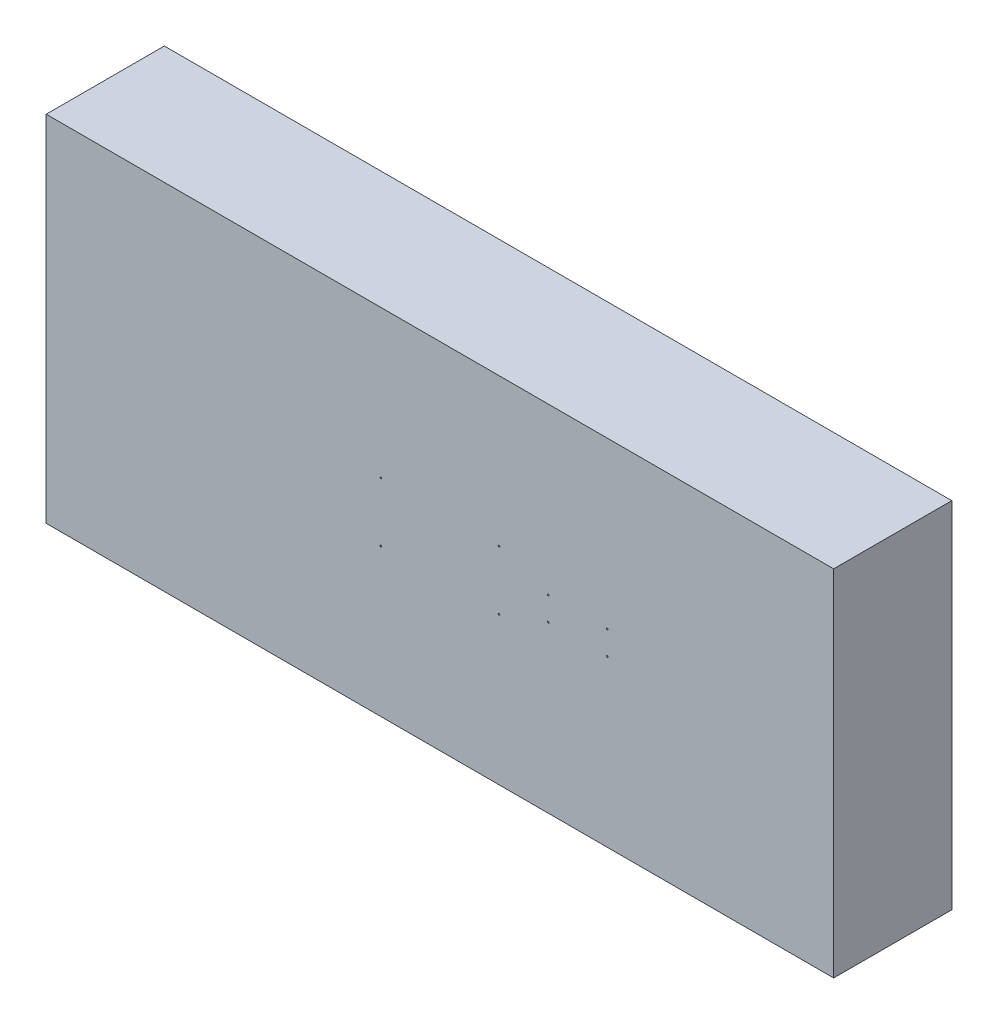
ISO-10303-21;
HEADER;
FILE_DESCRIPTION(('STEP AP214'),'2;1');
FILE_NAME('part.step','',(''),(''),'','','');
FILE_SCHEMA(('AUTOMOTIVE_DESIGN { 1 0 10303 214 1 1 1 1 }'));
ENDSEC;
DATA;
#1=APPLICATION_CONTEXT('core data for automotive mechanical design processes');
#2=APPLICATION_PROTOCOL_DEFINITION('international standard','automotive_design',2000,#1);
#3=PRODUCT_CONTEXT('',#1,'mechanical');
#4=PRODUCT('Part','Part','',(#3));
#5=PRODUCT_RELATED_PRODUCT_CATEGORY('part','',(#4));
#6=PRODUCT_DEFINITION_FORMATION('','',#4);
#7=PRODUCT_DEFINITION_CONTEXT('part definition',#1,'design');
#8=PRODUCT_DEFINITION('design','',#6,#7);
#9=PRODUCT_DEFINITION_SHAPE('','',#8);
#10=(LENGTH_UNIT() NAMED_UNIT(*) SI_UNIT(.MILLI.,.METRE.));
#11=(NAMED_UNIT(*) PLANE_ANGLE_UNIT() SI_UNIT($,.RADIAN.));
#12=(NAMED_UNIT(*) SI_UNIT($,.STERADIAN.) SOLID_ANGLE_UNIT());
#13=UNCERTAINTY_MEASURE_WITH_UNIT(LENGTH_MEASURE(1.E-05),#10,'distance_accuracy_value','');
#14=(GEOMETRIC_REPRESENTATION_CONTEXT(3) GLOBAL_UNCERTAINTY_ASSIGNED_CONTEXT((#13)) GLOBAL_UNIT_ASSIGNED_CONTEXT((#10,
#11,#12)) REPRESENTATION_CONTEXT('',''));
#15=CARTESIAN_POINT('',(0.,0.,0.));
#16=DIRECTION('',(0.,0.,1.));
#17=DIRECTION('',(1.,0.,0.));
#18=AXIS2_PLACEMENT_3D('',#15,#16,#17);
#19=CARTESIAN_POINT('',(-500.,0.,0.));
#20=DIRECTION('',(0.,-1.,0.));
#21=DIRECTION('',(0.,0.,-1.));
#22=AXIS2_PLACEMENT_3D('',#19,#20,#21);
#23=PLANE('',#22);
#24=DIRECTION('',(1.,0.,0.));
#25=VECTOR('',#24,1.);
#26=CARTESIAN_POINT('',(-500.,0.,150.));
#27=LINE('',#26,#25);
#28=CARTESIAN_POINT('',(-500.,0.,150.));
#29=VERTEX_POINT('',#28);
#30=CARTESIAN_POINT('',(500.,0.,150.));
#31=VERTEX_POINT('',#30);
#32=EDGE_CURVE('E46',#29,#31,#27,.T.);
#33=ORIENTED_EDGE('',*,*,#32,.T.);
#34=DIRECTION('',(0.,0.,-1.));
#35=VECTOR('',#34,1.);
#36=CARTESIAN_POINT('',(500.,0.,0.));
#37=LINE('',#36,#35);
#38=CARTESIAN_POINT('',(500.,0.,0.));
#39=VERTEX_POINT('',#38);
#40=EDGE_CURVE('E190',#31,#39,#37,.T.);
#41=ORIENTED_EDGE('',*,*,#40,.T.);
#42=DIRECTION('',(1.,0.,0.));
#43=VECTOR('',#42,1.);
#44=CARTESIAN_POINT('',(-500.,0.,0.));
#45=LINE('',#44,#43);
#46=CARTESIAN_POINT('',(-500.,0.,0.));
#47=VERTEX_POINT('',#46);
#48=EDGE_CURVE('E11',#47,#39,#45,.T.);
#49=ORIENTED_EDGE('',*,*,#48,.F.);
#50=DIRECTION('',(0.,0.,-1.));
#51=VECTOR('',#50,1.);
#52=CARTESIAN_POINT('',(-500.,0.,0.));
#53=LINE('',#52,#51);
#54=EDGE_CURVE('E56',#29,#47,#53,.T.);
#55=ORIENTED_EDGE('',*,*,#54,.F.);
#56=EDGE_LOOP('',(#33,#41,#49,#55));
#57=FACE_BOUND('',#56,.T.);
#58=ADVANCED_FACE('F43',(#57),#23,.F.);
#59=CARTESIAN_POINT('',(-500.,0.,0.));
#60=DIRECTION('',(0.,0.,-1.));
#61=DIRECTION('',(0.,1.,0.));
#62=AXIS2_PLACEMENT_3D('',#59,#60,#61);
#63=PLANE('',#62);
#64=ORIENTED_EDGE('',*,*,#48,.T.);
#65=DIRECTION('',(0.,1.,0.));
#66=VECTOR('',#65,1.);
#67=CARTESIAN_POINT('',(500.,0.,0.));
#68=LINE('',#67,#66);
#69=CARTESIAN_POINT('',(500.,-450.,0.));
#70=VERTEX_POINT('',#69);
#71=EDGE_CURVE('E198',#70,#39,#68,.T.);
#72=ORIENTED_EDGE('',*,*,#71,.F.);
#73=DIRECTION('',(1.,0.,0.));
#74=VECTOR('',#73,1.);
#75=CARTESIAN_POINT('',(-500.,-450.,0.));
#76=LINE('',#75,#74);
#77=CARTESIAN_POINT('',(-500.,-450.,0.));
#78=VERTEX_POINT('',#77);
#79=EDGE_CURVE('E51',#78,#70,#76,.T.);
#80=ORIENTED_EDGE('',*,*,#79,.F.);
#81=DIRECTION('',(0.,1.,0.));
#82=VECTOR('',#81,1.);
#83=CARTESIAN_POINT('',(-500.,0.,0.));
#84=LINE('',#83,#82);
#85=EDGE_CURVE('E203',#78,#47,#84,.T.);
#86=ORIENTED_EDGE('',*,*,#85,.T.);
#87=EDGE_LOOP('',(#64,#72,#80,#86));
#88=FACE_BOUND('',#87,.T.);
#89=ADVANCED_FACE('F226',(#88),#63,.T.);
#90=CARTESIAN_POINT('',(-500.,-450.,0.));
#91=DIRECTION('',(0.,-1.,0.));
#92=DIRECTION('',(0.,0.,-1.));
#93=AXIS2_PLACEMENT_3D('',#90,#91,#92);
#94=PLANE('',#93);
#95=ORIENTED_EDGE('',*,*,#79,.T.);
#96=DIRECTION('',(0.,0.,-1.));
#97=VECTOR('',#96,1.);
#98=CARTESIAN_POINT('',(500.,-450.,0.));
#99=LINE('',#98,#97);
#100=CARTESIAN_POINT('',(500.,-450.,150.));
#101=VERTEX_POINT('',#100);
#102=EDGE_CURVE('E195',#101,#70,#99,.T.);
#103=ORIENTED_EDGE('',*,*,#102,.F.);
#104=DIRECTION('',(1.,0.,0.));
#105=VECTOR('',#104,1.);
#106=CARTESIAN_POINT('',(-500.,-450.,150.));
#107=LINE('',#106,#105);
#108=CARTESIAN_POINT('',(-500.,-450.,150.));
#109=VERTEX_POINT('',#108);
#110=EDGE_CURVE('E207',#109,#101,#107,.T.);
#111=ORIENTED_EDGE('',*,*,#110,.F.);
#112=DIRECTION('',(0.,0.,-1.));
#113=VECTOR('',#112,1.);
#114=CARTESIAN_POINT('',(-500.,-450.,0.));
#115=LINE('',#114,#113);
#116=EDGE_CURVE('E205',#109,#78,#115,.T.);
#117=ORIENTED_EDGE('',*,*,#116,.T.);
#118=EDGE_LOOP('',(#95,#103,#111,#117));
#119=FACE_BOUND('',#118,.T.);
#120=ADVANCED_FACE('F220',(#119),#94,.T.);
#121=CARTESIAN_POINT('',(-500.,0.,150.));
#122=DIRECTION('',(0.,0.,-1.));
#123=DIRECTION('',(-1.,0.,0.));
#124=AXIS2_PLACEMENT_3D('',#121,#122,#123);
#125=PLANE('',#124);
#126=CARTESIAN_POINT('',(137.5,-210.,150.));
#127=DIRECTION('',(0.,0.,1.));
#128=DIRECTION('',(1.,0.,0.));
#129=AXIS2_PLACEMENT_3D('',#126,#127,#128);
#130=CIRCLE('',#129,1.025);
#131=CARTESIAN_POINT('',(138.525,-210.,150.));
#132=VERTEX_POINT('',#131);
#133=EDGE_CURVE('E121',#132,#132,#130,.T.);
#134=ORIENTED_EDGE('',*,*,#133,.F.);
#135=EDGE_LOOP('',(#134));
#136=FACE_BOUND('',#135,.T.);
#137=CARTESIAN_POINT('',(137.5,-240.,150.));
#138=DIRECTION('',(0.,0.,1.));
#139=DIRECTION('',(1.,0.,0.));
#140=AXIS2_PLACEMENT_3D('',#137,#138,#139);
#141=CIRCLE('',#140,1.025);
#142=CARTESIAN_POINT('',(138.525,-240.,150.));
#143=VERTEX_POINT('',#142);
#144=EDGE_CURVE('E120',#143,#143,#141,.T.);
#145=ORIENTED_EDGE('',*,*,#144,.F.);
#146=EDGE_LOOP('',(#145));
#147=FACE_BOUND('',#146,.T.);
#148=CARTESIAN_POINT('',(212.5,-240.,150.));
#149=DIRECTION('',(0.,0.,1.));
#150=DIRECTION('',(1.,0.,0.));
#151=AXIS2_PLACEMENT_3D('',#148,#149,#150);
#152=CIRCLE('',#151,1.025);
#153=CARTESIAN_POINT('',(213.525,-240.,150.));
#154=VERTEX_POINT('',#153);
#155=EDGE_CURVE('E132',#154,#154,#152,.T.);
#156=ORIENTED_EDGE('',*,*,#155,.F.);
#157=EDGE_LOOP('',(#156));
#158=FACE_BOUND('',#157,.T.);
#159=CARTESIAN_POINT('',(212.5,-210.,150.));
#160=DIRECTION('',(0.,0.,1.));
#161=DIRECTION('',(1.,0.,0.));
#162=AXIS2_PLACEMENT_3D('',#159,#160,#161);
#163=CIRCLE('',#162,1.025);
#164=CARTESIAN_POINT('',(213.525,-210.,150.));
#165=VERTEX_POINT('',#164);
#166=EDGE_CURVE('E145',#165,#165,#163,.T.);
#167=ORIENTED_EDGE('',*,*,#166,.F.);
#168=EDGE_LOOP('',(#167));
#169=FACE_BOUND('',#168,.T.);
#170=CARTESIAN_POINT('',(-75.,-187.5,150.));
#171=DIRECTION('',(0.,0.,1.));
#172=DIRECTION('',(1.,0.,0.));
#173=AXIS2_PLACEMENT_3D('',#170,#171,#172);
#174=CIRCLE('',#173,1.025);
#175=CARTESIAN_POINT('',(-73.975,-187.5,150.));
#176=VERTEX_POINT('',#175);
#177=EDGE_CURVE('E153',#176,#176,#174,.T.);
#178=ORIENTED_EDGE('',*,*,#177,.F.);
#179=EDGE_LOOP('',(#178));
#180=FACE_BOUND('',#179,.T.);
#181=CARTESIAN_POINT('',(-75.,-262.5,150.));
#182=DIRECTION('',(0.,0.,1.));
#183=DIRECTION('',(1.,0.,0.));
#184=AXIS2_PLACEMENT_3D('',#181,#182,#183);
#185=CIRCLE('',#184,1.025);
#186=CARTESIAN_POINT('',(-73.975,-262.5,150.));
#187=VERTEX_POINT('',#186);
#188=EDGE_CURVE('E159',#187,#187,#185,.T.);
#189=ORIENTED_EDGE('',*,*,#188,.F.);
#190=EDGE_LOOP('',(#189));
#191=FACE_BOUND('',#190,.T.);
#192=CARTESIAN_POINT('',(75.,-187.5,150.));
#193=DIRECTION('',(0.,0.,1.));
#194=DIRECTION('',(1.,0.,0.));
#195=AXIS2_PLACEMENT_3D('',#192,#193,#194);
#196=CIRCLE('',#195,1.025);
#197=CARTESIAN_POINT('',(76.025,-187.5,150.));
#198=VERTEX_POINT('',#197);
#199=EDGE_CURVE('E169',#198,#198,#196,.T.);
#200=ORIENTED_EDGE('',*,*,#199,.F.);
#201=EDGE_LOOP('',(#200));
#202=FACE_BOUND('',#201,.T.);
#203=CARTESIAN_POINT('',(75.,-262.5,150.));
#204=DIRECTION('',(0.,0.,1.));
#205=DIRECTION('',(1.,0.,0.));
#206=AXIS2_PLACEMENT_3D('',#203,#204,#205);
#207=CIRCLE('',#206,1.025);
#208=CARTESIAN_POINT('',(76.025,-262.5,150.));
#209=VERTEX_POINT('',#208);
#210=EDGE_CURVE('E178',#209,#209,#207,.T.);
#211=ORIENTED_EDGE('',*,*,#210,.F.);
#212=EDGE_LOOP('',(#211));
#213=FACE_BOUND('',#212,.T.);
#214=ORIENTED_EDGE('',*,*,#110,.T.);
#215=DIRECTION('',(0.,1.,0.));
#216=VECTOR('',#215,1.);
#217=CARTESIAN_POINT('',(500.,0.,150.));
#218=LINE('',#217,#216);
#219=EDGE_CURVE('E188',#101,#31,#218,.T.);
#220=ORIENTED_EDGE('',*,*,#219,.T.);
#221=ORIENTED_EDGE('',*,*,#32,.F.);
#222=DIRECTION('',(0.,1.,0.));
#223=VECTOR('',#222,1.);
#224=CARTESIAN_POINT('',(-500.,0.,150.));
#225=LINE('',#224,#223);
#226=EDGE_CURVE('E196',#109,#29,#225,.T.);
#227=ORIENTED_EDGE('',*,*,#226,.F.);
#228=EDGE_LOOP('',(#214,#220,#221,#227));
#229=FACE_BOUND('',#228,.T.);
#230=ADVANCED_FACE('F218',(#136,#147,#158,#169,#180,#191,#202,#213,#229),#125,.F.);
#231=CARTESIAN_POINT('',(-500.,0.,0.));
#232=DIRECTION('',(1.,0.,0.));
#233=DIRECTION('',(0.,0.,-1.));
#234=AXIS2_PLACEMENT_3D('',#231,#232,#233);
#235=PLANE('',#234);
#236=ORIENTED_EDGE('',*,*,#54,.T.);
#237=ORIENTED_EDGE('',*,*,#85,.F.);
#238=ORIENTED_EDGE('',*,*,#116,.F.);
#239=ORIENTED_EDGE('',*,*,#226,.T.);
#240=EDGE_LOOP('',(#236,#237,#238,#239));
#241=FACE_BOUND('',#240,.T.);
#242=ADVANCED_FACE('F217',(#241),#235,.F.);
#243=CARTESIAN_POINT('',(500.,0.,0.));
#244=DIRECTION('',(1.,0.,0.));
#245=DIRECTION('',(0.,0.,-1.));
#246=AXIS2_PLACEMENT_3D('',#243,#244,#245);
#247=PLANE('',#246);
#248=ORIENTED_EDGE('',*,*,#40,.F.);
#249=ORIENTED_EDGE('',*,*,#219,.F.);
#250=ORIENTED_EDGE('',*,*,#102,.T.);
#251=ORIENTED_EDGE('',*,*,#71,.T.);
#252=EDGE_LOOP('',(#248,#249,#250,#251));
#253=FACE_BOUND('',#252,.T.);
#254=ADVANCED_FACE('F212',(#253),#247,.T.);
#255=CARTESIAN_POINT('',(75.,-262.5,140.));
#256=DIRECTION('',(0.,0.,1.));
#257=DIRECTION('',(1.,0.,0.));
#258=AXIS2_PLACEMENT_3D('',#255,#256,#257);
#259=CONICAL_SURFACE('',#258,0.999999999999987,1.02974425867663);
#260=CARTESIAN_POINT('',(75.,-262.5,139.399139380972));
#261=VERTEX_POINT('',#260);
#262=VERTEX_LOOP('',#261);
#263=FACE_BOUND('',#262,.T.);
#264=CARTESIAN_POINT('',(75.,-262.5,140.));
#265=DIRECTION('',(0.,0.,1.));
#266=DIRECTION('',(1.,0.,0.));
#267=AXIS2_PLACEMENT_3D('',#264,#265,#266);
#268=CIRCLE('',#267,0.999999999999987);
#269=CARTESIAN_POINT('',(76.,-262.5,140.));
#270=VERTEX_POINT('',#269);
#271=EDGE_CURVE('E183',#270,#270,#268,.T.);
#272=ORIENTED_EDGE('',*,*,#271,.T.);
#273=EDGE_LOOP('',(#272));
#274=FACE_BOUND('',#273,.T.);
#275=ADVANCED_FACE('F243',(#263,#274),#259,.F.);
#276=CARTESIAN_POINT('',(75.,-262.5,150.));
#277=DIRECTION('',(0.,0.,1.));
#278=DIRECTION('',(1.,0.,0.));
#279=AXIS2_PLACEMENT_3D('',#276,#277,#278);
#280=CYLINDRICAL_SURFACE('',#279,0.999999999999987);
#281=ORIENTED_EDGE('',*,*,#271,.F.);
#282=EDGE_LOOP('',(#281));
#283=FACE_BOUND('',#282,.T.);
#284=CARTESIAN_POINT('',(75.,-262.5,149.975));
#285=DIRECTION('',(0.,0.,1.));
#286=DIRECTION('',(1.,0.,0.));
#287=AXIS2_PLACEMENT_3D('',#284,#285,#286);
#288=CIRCLE('',#287,0.999999999999987);
#289=CARTESIAN_POINT('',(76.,-262.5,149.975));
#290=VERTEX_POINT('',#289);
#291=EDGE_CURVE('E181',#290,#290,#288,.T.);
#292=ORIENTED_EDGE('',*,*,#291,.T.);
#293=EDGE_LOOP('',(#292));
#294=FACE_BOUND('',#293,.T.);
#295=ADVANCED_FACE('F246',(#283,#294),#280,.F.);
#296=CARTESIAN_POINT('',(75.,-262.5,150.));
#297=DIRECTION('',(0.,0.,1.));
#298=DIRECTION('',(1.,0.,0.));
#299=AXIS2_PLACEMENT_3D('',#296,#297,#298);
#300=CONICAL_SURFACE('',#299,1.025,0.785398163397171);
#301=ORIENTED_EDGE('',*,*,#291,.F.);
#302=EDGE_LOOP('',(#301));
#303=FACE_BOUND('',#302,.T.);
#304=ORIENTED_EDGE('',*,*,#210,.T.);
#305=EDGE_LOOP('',(#304));
#306=FACE_BOUND('',#305,.T.);
#307=ADVANCED_FACE('F249',(#303,#306),#300,.F.);
#308=CARTESIAN_POINT('',(75.,-187.5,140.));
#309=DIRECTION('',(0.,0.,1.));
#310=DIRECTION('',(1.,0.,0.));
#311=AXIS2_PLACEMENT_3D('',#308,#309,#310);
#312=CONICAL_SURFACE('',#311,0.999999999999987,1.02974425867663);
#313=CARTESIAN_POINT('',(75.,-187.5,139.399139380972));
#314=VERTEX_POINT('',#313);
#315=VERTEX_LOOP('',#314);
#316=FACE_BOUND('',#315,.T.);
#317=CARTESIAN_POINT('',(75.,-187.5,140.));
#318=DIRECTION('',(0.,0.,1.));
#319=DIRECTION('',(1.,0.,0.));
#320=AXIS2_PLACEMENT_3D('',#317,#318,#319);
#321=CIRCLE('',#320,0.999999999999987);
#322=CARTESIAN_POINT('',(76.,-187.5,140.));
#323=VERTEX_POINT('',#322);
#324=EDGE_CURVE('E174',#323,#323,#321,.T.);
#325=ORIENTED_EDGE('',*,*,#324,.T.);
#326=EDGE_LOOP('',(#325));
#327=FACE_BOUND('',#326,.T.);
#328=ADVANCED_FACE('F251',(#316,#327),#312,.F.);
#329=CARTESIAN_POINT('',(75.,-187.5,150.));
#330=DIRECTION('',(0.,0.,1.));
#331=DIRECTION('',(1.,0.,0.));
#332=AXIS2_PLACEMENT_3D('',#329,#330,#331);
#333=CYLINDRICAL_SURFACE('',#332,0.999999999999987);
#334=ORIENTED_EDGE('',*,*,#324,.F.);
#335=EDGE_LOOP('',(#334));
#336=FACE_BOUND('',#335,.T.);
#337=CARTESIAN_POINT('',(75.,-187.5,149.975));
#338=DIRECTION('',(0.,0.,1.));
#339=DIRECTION('',(1.,0.,0.));
#340=AXIS2_PLACEMENT_3D('',#337,#338,#339);
#341=CIRCLE('',#340,0.999999999999987);
#342=CARTESIAN_POINT('',(76.,-187.5,149.975));
#343=VERTEX_POINT('',#342);
#344=EDGE_CURVE('E175',#343,#343,#341,.T.);
#345=ORIENTED_EDGE('',*,*,#344,.T.);
#346=EDGE_LOOP('',(#345));
#347=FACE_BOUND('',#346,.T.);
#348=ADVANCED_FACE('F260',(#336,#347),#333,.F.);
#349=CARTESIAN_POINT('',(75.,-187.5,150.));
#350=DIRECTION('',(0.,0.,1.));
#351=DIRECTION('',(1.,0.,0.));
#352=AXIS2_PLACEMENT_3D('',#349,#350,#351);
#353=CONICAL_SURFACE('',#352,1.025,0.785398163397171);
#354=ORIENTED_EDGE('',*,*,#344,.F.);
#355=EDGE_LOOP('',(#354));
#356=FACE_BOUND('',#355,.T.);
#357=ORIENTED_EDGE('',*,*,#199,.T.);
#358=EDGE_LOOP('',(#357));
#359=FACE_BOUND('',#358,.T.);
#360=ADVANCED_FACE('F264',(#356,#359),#353,.F.);
#361=CARTESIAN_POINT('',(-75.,-262.5,140.));
#362=DIRECTION('',(0.,0.,1.));
#363=DIRECTION('',(1.,0.,0.));
#364=AXIS2_PLACEMENT_3D('',#361,#362,#363);
#365=CONICAL_SURFACE('',#364,0.999999999999987,1.02974425867663);
#366=CARTESIAN_POINT('',(-75.,-262.5,139.399139380972));
#367=VERTEX_POINT('',#366);
#368=VERTEX_LOOP('',#367);
#369=FACE_BOUND('',#368,.T.);
#370=CARTESIAN_POINT('',(-75.,-262.5,140.));
#371=DIRECTION('',(0.,0.,1.));
#372=DIRECTION('',(1.,0.,0.));
#373=AXIS2_PLACEMENT_3D('',#370,#371,#372);
#374=CIRCLE('',#373,0.999999999999987);
#375=CARTESIAN_POINT('',(-74.,-262.5,140.));
#376=VERTEX_POINT('',#375);
#377=EDGE_CURVE('E168',#376,#376,#374,.T.);
#378=ORIENTED_EDGE('',*,*,#377,.T.);
#379=EDGE_LOOP('',(#378));
#380=FACE_BOUND('',#379,.T.);
#381=ADVANCED_FACE('F266',(#369,#380),#365,.F.);
#382=CARTESIAN_POINT('',(-75.,-262.5,150.));
#383=DIRECTION('',(0.,0.,1.));
#384=DIRECTION('',(1.,0.,0.));
#385=AXIS2_PLACEMENT_3D('',#382,#383,#384);
#386=CYLINDRICAL_SURFACE('',#385,0.999999999999987);
#387=ORIENTED_EDGE('',*,*,#377,.F.);
#388=EDGE_LOOP('',(#387));
#389=FACE_BOUND('',#388,.T.);
#390=CARTESIAN_POINT('',(-75.,-262.5,149.975));
#391=DIRECTION('',(0.,0.,1.));
#392=DIRECTION('',(1.,0.,0.));
#393=AXIS2_PLACEMENT_3D('',#390,#391,#392);
#394=CIRCLE('',#393,0.999999999999987);
#395=CARTESIAN_POINT('',(-74.,-262.5,149.975));
#396=VERTEX_POINT('',#395);
#397=EDGE_CURVE('E161',#396,#396,#394,.T.);
#398=ORIENTED_EDGE('',*,*,#397,.T.);
#399=EDGE_LOOP('',(#398));
#400=FACE_BOUND('',#399,.T.);
#401=ADVANCED_FACE('F269',(#389,#400),#386,.F.);
#402=CARTESIAN_POINT('',(-75.,-262.5,150.));
#403=DIRECTION('',(0.,0.,1.));
#404=DIRECTION('',(1.,0.,0.));
#405=AXIS2_PLACEMENT_3D('',#402,#403,#404);
#406=CONICAL_SURFACE('',#405,1.025,0.785398163397171);
#407=ORIENTED_EDGE('',*,*,#397,.F.);
#408=EDGE_LOOP('',(#407));
#409=FACE_BOUND('',#408,.T.);
#410=ORIENTED_EDGE('',*,*,#188,.T.);
#411=EDGE_LOOP('',(#410));
#412=FACE_BOUND('',#411,.T.);
#413=ADVANCED_FACE('F274',(#409,#412),#406,.F.);
#414=CARTESIAN_POINT('',(-75.,-187.5,140.));
#415=DIRECTION('',(0.,0.,1.));
#416=DIRECTION('',(1.,0.,0.));
#417=AXIS2_PLACEMENT_3D('',#414,#415,#416);
#418=CONICAL_SURFACE('',#417,0.999999999999987,1.02974425867663);
#419=CARTESIAN_POINT('',(-75.,-187.5,139.399139380972));
#420=VERTEX_POINT('',#419);
#421=VERTEX_LOOP('',#420);
#422=FACE_BOUND('',#421,.T.);
#423=CARTESIAN_POINT('',(-75.,-187.5,140.));
#424=DIRECTION('',(0.,0.,1.));
#425=DIRECTION('',(1.,0.,0.));
#426=AXIS2_PLACEMENT_3D('',#423,#424,#425);
#427=CIRCLE('',#426,0.999999999999987);
#428=CARTESIAN_POINT('',(-74.,-187.5,140.));
#429=VERTEX_POINT('',#428);
#430=EDGE_CURVE('E160',#429,#429,#427,.T.);
#431=ORIENTED_EDGE('',*,*,#430,.T.);
#432=EDGE_LOOP('',(#431));
#433=FACE_BOUND('',#432,.T.);
#434=ADVANCED_FACE('F280',(#422,#433),#418,.F.);
#435=CARTESIAN_POINT('',(-75.,-187.5,150.));
#436=DIRECTION('',(0.,0.,1.));
#437=DIRECTION('',(1.,0.,0.));
#438=AXIS2_PLACEMENT_3D('',#435,#436,#437);
#439=CYLINDRICAL_SURFACE('',#438,0.999999999999987);
#440=ORIENTED_EDGE('',*,*,#430,.F.);
#441=EDGE_LOOP('',(#440));
#442=FACE_BOUND('',#441,.T.);
#443=CARTESIAN_POINT('',(-75.,-187.5,149.975));
#444=DIRECTION('',(0.,0.,1.));
#445=DIRECTION('',(1.,0.,0.));
#446=AXIS2_PLACEMENT_3D('',#443,#444,#445);
#447=CIRCLE('',#446,0.999999999999987);
#448=CARTESIAN_POINT('',(-74.,-187.5,149.975));
#449=VERTEX_POINT('',#448);
#450=EDGE_CURVE('E155',#449,#449,#447,.T.);
#451=ORIENTED_EDGE('',*,*,#450,.T.);
#452=EDGE_LOOP('',(#451));
#453=FACE_BOUND('',#452,.T.);
#454=ADVANCED_FACE('F284',(#442,#453),#439,.F.);
#455=CARTESIAN_POINT('',(-75.,-187.5,150.));
#456=DIRECTION('',(0.,0.,1.));
#457=DIRECTION('',(1.,0.,0.));
#458=AXIS2_PLACEMENT_3D('',#455,#456,#457);
#459=CONICAL_SURFACE('',#458,1.025,0.785398163397171);
#460=ORIENTED_EDGE('',*,*,#450,.F.);
#461=EDGE_LOOP('',(#460));
#462=FACE_BOUND('',#461,.T.);
#463=ORIENTED_EDGE('',*,*,#177,.T.);
#464=EDGE_LOOP('',(#463));
#465=FACE_BOUND('',#464,.T.);
#466=ADVANCED_FACE('F286',(#462,#465),#459,.F.);
#467=CARTESIAN_POINT('',(212.5,-210.,140.));
#468=DIRECTION('',(0.,0.,1.));
#469=DIRECTION('',(1.,0.,0.));
#470=AXIS2_PLACEMENT_3D('',#467,#468,#469);
#471=CONICAL_SURFACE('',#470,1.,1.02974425867666);
#472=CARTESIAN_POINT('',(212.5,-210.,139.399139380972));
#473=VERTEX_POINT('',#472);
#474=VERTEX_LOOP('',#473);
#475=FACE_BOUND('',#474,.T.);
#476=CARTESIAN_POINT('',(212.5,-210.,140.));
#477=DIRECTION('',(0.,0.,1.));
#478=DIRECTION('',(1.,0.,0.));
#479=AXIS2_PLACEMENT_3D('',#476,#477,#478);
#480=CIRCLE('',#479,1.);
#481=CARTESIAN_POINT('',(213.5,-210.,140.));
#482=VERTEX_POINT('',#481);
#483=EDGE_CURVE('E150',#482,#482,#480,.T.);
#484=ORIENTED_EDGE('',*,*,#483,.T.);
#485=EDGE_LOOP('',(#484));
#486=FACE_BOUND('',#485,.T.);
#487=ADVANCED_FACE('F288',(#475,#486),#471,.F.);
#488=CARTESIAN_POINT('',(212.5,-210.,150.));
#489=DIRECTION('',(0.,0.,1.));
#490=DIRECTION('',(1.,0.,0.));
#491=AXIS2_PLACEMENT_3D('',#488,#489,#490);
#492=CYLINDRICAL_SURFACE('',#491,1.);
#493=ORIENTED_EDGE('',*,*,#483,.F.);
#494=EDGE_LOOP('',(#493));
#495=FACE_BOUND('',#494,.T.);
#496=CARTESIAN_POINT('',(212.5,-210.,149.975));
#497=DIRECTION('',(0.,0.,1.));
#498=DIRECTION('',(1.,0.,0.));
#499=AXIS2_PLACEMENT_3D('',#496,#497,#498);
#500=CIRCLE('',#499,1.);
#501=CARTESIAN_POINT('',(213.5,-210.,149.975));
#502=VERTEX_POINT('',#501);
#503=EDGE_CURVE('E143',#502,#502,#500,.T.);
#504=ORIENTED_EDGE('',*,*,#503,.T.);
#505=EDGE_LOOP('',(#504));
#506=FACE_BOUND('',#505,.T.);
#507=ADVANCED_FACE('F292',(#495,#506),#492,.F.);
#508=CARTESIAN_POINT('',(212.5,-210.,150.));
#509=DIRECTION('',(0.,0.,1.));
#510=DIRECTION('',(1.,0.,0.));
#511=AXIS2_PLACEMENT_3D('',#508,#509,#510);
#512=CONICAL_SURFACE('',#511,1.025,0.785398163397448);
#513=ORIENTED_EDGE('',*,*,#503,.F.);
#514=EDGE_LOOP('',(#513));
#515=FACE_BOUND('',#514,.T.);
#516=ORIENTED_EDGE('',*,*,#166,.T.);
#517=EDGE_LOOP('',(#516));
#518=FACE_BOUND('',#517,.T.);
#519=ADVANCED_FACE('F298',(#515,#518),#512,.F.);
#520=CARTESIAN_POINT('',(212.5,-240.,140.));
#521=DIRECTION('',(0.,0.,1.));
#522=DIRECTION('',(1.,0.,0.));
#523=AXIS2_PLACEMENT_3D('',#520,#521,#522);
#524=CONICAL_SURFACE('',#523,1.,1.02974425867666);
#525=CARTESIAN_POINT('',(212.5,-240.,139.399139380972));
#526=VERTEX_POINT('',#525);
#527=VERTEX_LOOP('',#526);
#528=FACE_BOUND('',#527,.T.);
#529=CARTESIAN_POINT('',(212.5,-240.,140.));
#530=DIRECTION('',(0.,0.,1.));
#531=DIRECTION('',(1.,0.,0.));
#532=AXIS2_PLACEMENT_3D('',#529,#530,#531);
#533=CIRCLE('',#532,1.);
#534=CARTESIAN_POINT('',(213.5,-240.,140.));
#535=VERTEX_POINT('',#534);
#536=EDGE_CURVE('E138',#535,#535,#533,.T.);
#537=ORIENTED_EDGE('',*,*,#536,.T.);
#538=EDGE_LOOP('',(#537));
#539=FACE_BOUND('',#538,.T.);
#540=ADVANCED_FACE('F297',(#528,#539),#524,.F.);
#541=CARTESIAN_POINT('',(212.5,-240.,150.));
#542=DIRECTION('',(0.,0.,1.));
#543=DIRECTION('',(1.,0.,0.));
#544=AXIS2_PLACEMENT_3D('',#541,#542,#543);
#545=CYLINDRICAL_SURFACE('',#544,1.);
#546=ORIENTED_EDGE('',*,*,#536,.F.);
#547=EDGE_LOOP('',(#546));
#548=FACE_BOUND('',#547,.T.);
#549=CARTESIAN_POINT('',(212.5,-240.,149.975));
#550=DIRECTION('',(0.,0.,1.));
#551=DIRECTION('',(1.,0.,0.));
#552=AXIS2_PLACEMENT_3D('',#549,#550,#551);
#553=CIRCLE('',#552,1.);
#554=CARTESIAN_POINT('',(213.5,-240.,149.975));
#555=VERTEX_POINT('',#554);
#556=EDGE_CURVE('E136',#555,#555,#553,.T.);
#557=ORIENTED_EDGE('',*,*,#556,.T.);
#558=EDGE_LOOP('',(#557));
#559=FACE_BOUND('',#558,.T.);
#560=ADVANCED_FACE('F302',(#548,#559),#545,.F.);
#561=CARTESIAN_POINT('',(212.5,-240.,150.));
#562=DIRECTION('',(0.,0.,1.));
#563=DIRECTION('',(1.,0.,0.));
#564=AXIS2_PLACEMENT_3D('',#561,#562,#563);
#565=CONICAL_SURFACE('',#564,1.025,0.785398163397448);
#566=ORIENTED_EDGE('',*,*,#556,.F.);
#567=EDGE_LOOP('',(#566));
#568=FACE_BOUND('',#567,.T.);
#569=ORIENTED_EDGE('',*,*,#155,.T.);
#570=EDGE_LOOP('',(#569));
#571=FACE_BOUND('',#570,.T.);
#572=ADVANCED_FACE('F308',(#568,#571),#565,.F.);
#573=CARTESIAN_POINT('',(137.5,-240.,140.));
#574=DIRECTION('',(0.,0.,1.));
#575=DIRECTION('',(1.,0.,0.));
#576=AXIS2_PLACEMENT_3D('',#573,#574,#575);
#577=CONICAL_SURFACE('',#576,1.,1.02974425867666);
#578=CARTESIAN_POINT('',(137.5,-240.,139.399139380972));
#579=VERTEX_POINT('',#578);
#580=VERTEX_LOOP('',#579);
#581=FACE_BOUND('',#580,.T.);
#582=CARTESIAN_POINT('',(137.5,-240.,140.));
#583=DIRECTION('',(0.,0.,1.));
#584=DIRECTION('',(1.,0.,0.));
#585=AXIS2_PLACEMENT_3D('',#582,#583,#584);
#586=CIRCLE('',#585,1.);
#587=CARTESIAN_POINT('',(138.5,-240.,140.));
#588=VERTEX_POINT('',#587);
#589=EDGE_CURVE('E127',#588,#588,#586,.T.);
#590=ORIENTED_EDGE('',*,*,#589,.T.);
#591=EDGE_LOOP('',(#590));
#592=FACE_BOUND('',#591,.T.);
#593=ADVANCED_FACE('F315',(#581,#592),#577,.F.);
#594=CARTESIAN_POINT('',(137.5,-240.,150.));
#595=DIRECTION('',(0.,0.,1.));
#596=DIRECTION('',(1.,0.,0.));
#597=AXIS2_PLACEMENT_3D('',#594,#595,#596);
#598=CYLINDRICAL_SURFACE('',#597,1.);
#599=ORIENTED_EDGE('',*,*,#589,.F.);
#600=EDGE_LOOP('',(#599));
#601=FACE_BOUND('',#600,.T.);
#602=CARTESIAN_POINT('',(137.5,-240.,149.975));
#603=DIRECTION('',(0.,0.,1.));
#604=DIRECTION('',(1.,0.,0.));
#605=AXIS2_PLACEMENT_3D('',#602,#603,#604);
#606=CIRCLE('',#605,1.);
#607=CARTESIAN_POINT('',(138.5,-240.,149.975));
#608=VERTEX_POINT('',#607);
#609=EDGE_CURVE('E122',#608,#608,#606,.T.);
#610=ORIENTED_EDGE('',*,*,#609,.T.);
#611=EDGE_LOOP('',(#610));
#612=FACE_BOUND('',#611,.T.);
#613=ADVANCED_FACE('F317',(#601,#612),#598,.F.);
#614=CARTESIAN_POINT('',(137.5,-240.,150.));
#615=DIRECTION('',(0.,0.,1.));
#616=DIRECTION('',(1.,0.,0.));
#617=AXIS2_PLACEMENT_3D('',#614,#615,#616);
#618=CONICAL_SURFACE('',#617,1.025,0.785398163397448);
#619=ORIENTED_EDGE('',*,*,#609,.F.);
#620=EDGE_LOOP('',(#619));
#621=FACE_BOUND('',#620,.T.);
#622=ORIENTED_EDGE('',*,*,#144,.T.);
#623=EDGE_LOOP('',(#622));
#624=FACE_BOUND('',#623,.T.);
#625=ADVANCED_FACE('F111',(#621,#624),#618,.F.);
#626=CARTESIAN_POINT('',(137.5,-210.,140.));
#627=DIRECTION('',(0.,0.,1.));
#628=DIRECTION('',(1.,0.,0.));
#629=AXIS2_PLACEMENT_3D('',#626,#627,#628);
#630=CONICAL_SURFACE('',#629,1.,1.02974425867666);
#631=CARTESIAN_POINT('',(137.5,-210.,139.399139380972));
#632=VERTEX_POINT('',#631);
#633=VERTEX_LOOP('',#632);
#634=FACE_BOUND('',#633,.T.);
#635=CARTESIAN_POINT('',(137.5,-210.,140.));
#636=DIRECTION('',(0.,0.,1.));
#637=DIRECTION('',(1.,0.,0.));
#638=AXIS2_PLACEMENT_3D('',#635,#636,#637);
#639=CIRCLE('',#638,1.);
#640=CARTESIAN_POINT('',(138.5,-210.,140.));
#641=VERTEX_POINT('',#640);
#642=EDGE_CURVE('E114',#641,#641,#639,.T.);
#643=ORIENTED_EDGE('',*,*,#642,.T.);
#644=EDGE_LOOP('',(#643));
#645=FACE_BOUND('',#644,.T.);
#646=ADVANCED_FACE('F110',(#634,#645),#630,.F.);
#647=CARTESIAN_POINT('',(137.5,-210.,150.));
#648=DIRECTION('',(0.,0.,1.));
#649=DIRECTION('',(1.,0.,0.));
#650=AXIS2_PLACEMENT_3D('',#647,#648,#649);
#651=CYLINDRICAL_SURFACE('',#650,1.);
#652=ORIENTED_EDGE('',*,*,#642,.F.);
#653=EDGE_LOOP('',(#652));
#654=FACE_BOUND('',#653,.T.);
#655=CARTESIAN_POINT('',(137.5,-210.,149.975));
#656=DIRECTION('',(0.,0.,1.));
#657=DIRECTION('',(1.,0.,0.));
#658=AXIS2_PLACEMENT_3D('',#655,#656,#657);
#659=CIRCLE('',#658,1.);
#660=CARTESIAN_POINT('',(138.5,-210.,149.975));
#661=VERTEX_POINT('',#660);
#662=EDGE_CURVE('E117',#661,#661,#659,.T.);
#663=ORIENTED_EDGE('',*,*,#662,.T.);
#664=EDGE_LOOP('',(#663));
#665=FACE_BOUND('',#664,.T.);
#666=ADVANCED_FACE('F109',(#654,#665),#651,.F.);
#667=CARTESIAN_POINT('',(137.5,-210.,150.));
#668=DIRECTION('',(0.,0.,1.));
#669=DIRECTION('',(1.,0.,0.));
#670=AXIS2_PLACEMENT_3D('',#667,#668,#669);
#671=CONICAL_SURFACE('',#670,1.025,0.785398163397448);
#672=ORIENTED_EDGE('',*,*,#662,.F.);
#673=EDGE_LOOP('',(#672));
#674=FACE_BOUND('',#673,.T.);
#675=ORIENTED_EDGE('',*,*,#133,.T.);
#676=EDGE_LOOP('',(#675));
#677=FACE_BOUND('',#676,.T.);
#678=ADVANCED_FACE('F328',(#674,#677),#671,.F.);
#679=CLOSED_SHELL('',(#58,#89,#120,#230,#242,#254,#275,#295,#307,#328,#348,#360,#381,#401,#413,
#434,#454,#466,#487,#507,#519,#540,#560,#572,#593,#613,#625,#646,#666,#678));
#680=MANIFOLD_SOLID_BREP('B2',#679);
#681=ADVANCED_BREP_SHAPE_REPRESENTATION('',(#18,#680),#14);
#682=SHAPE_DEFINITION_REPRESENTATION(#9,#681);
ENDSEC;
END-ISO-10303-21;
